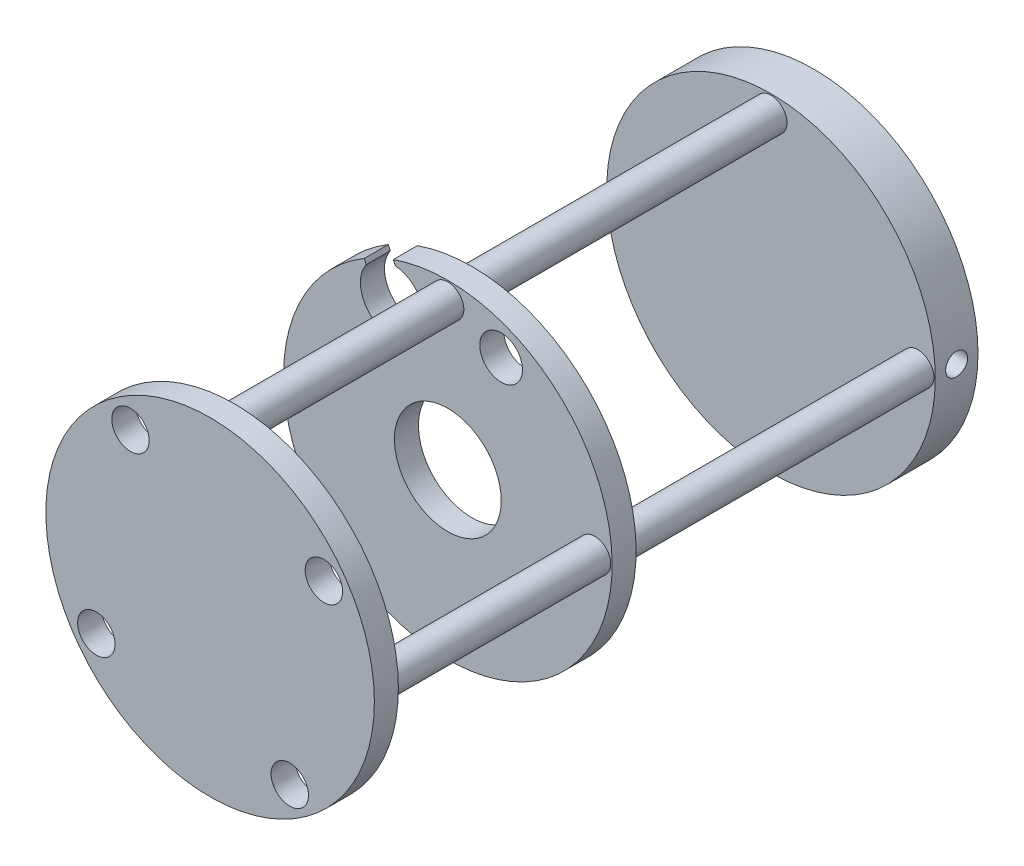
ISO-10303-21;
HEADER;
FILE_DESCRIPTION(('STEP AP214'),'2;1');
FILE_NAME('part.step','',(''),(''),'','','');
FILE_SCHEMA(('AUTOMOTIVE_DESIGN { 1 0 10303 214 1 1 1 1 }'));
ENDSEC;
DATA;
#1=APPLICATION_CONTEXT('core data for automotive mechanical design processes');
#2=APPLICATION_PROTOCOL_DEFINITION('international standard','automotive_design',2000,#1);
#3=PRODUCT_CONTEXT('',#1,'mechanical');
#4=PRODUCT('Part','Part','',(#3));
#5=PRODUCT_RELATED_PRODUCT_CATEGORY('part','',(#4));
#6=PRODUCT_DEFINITION_FORMATION('','',#4);
#7=PRODUCT_DEFINITION_CONTEXT('part definition',#1,'design');
#8=PRODUCT_DEFINITION('design','',#6,#7);
#9=PRODUCT_DEFINITION_SHAPE('','',#8);
#10=(LENGTH_UNIT() NAMED_UNIT(*) SI_UNIT(.MILLI.,.METRE.));
#11=(NAMED_UNIT(*) PLANE_ANGLE_UNIT() SI_UNIT($,.RADIAN.));
#12=(NAMED_UNIT(*) SI_UNIT($,.STERADIAN.) SOLID_ANGLE_UNIT());
#13=UNCERTAINTY_MEASURE_WITH_UNIT(LENGTH_MEASURE(1.E-05),#10,'distance_accuracy_value','');
#14=(GEOMETRIC_REPRESENTATION_CONTEXT(3) GLOBAL_UNCERTAINTY_ASSIGNED_CONTEXT((#13)) GLOBAL_UNIT_ASSIGNED_CONTEXT((#10,
#11,#12)) REPRESENTATION_CONTEXT('',''));
#15=CARTESIAN_POINT('',(0.,0.,0.));
#16=DIRECTION('',(0.,0.,1.));
#17=DIRECTION('',(1.,0.,0.));
#18=AXIS2_PLACEMENT_3D('',#15,#16,#17);
#19=CARTESIAN_POINT('',(0.,0.,8.));
#20=DIRECTION('',(0.,0.,-1.));
#21=DIRECTION('',(-1.,0.,0.));
#22=AXIS2_PLACEMENT_3D('',#19,#20,#21);
#23=CYLINDRICAL_SURFACE('',#22,30.75);
#24=CARTESIAN_POINT('',(30.7489837230436,0.249999999999997,6.05));
#25=CARTESIAN_POINT('',(30.7480473841755,0.365054128626898,6.04999493741304));
#26=CARTESIAN_POINT('',(30.7464595504185,0.480183356898924,6.04028147835291));
#27=CARTESIAN_POINT('',(30.7420759657299,0.70725092235472,6.00167772018999));
#28=CARTESIAN_POINT('',(30.7392788091532,0.819185384237812,5.97276508408072));
#29=CARTESIAN_POINT('',(30.7327170546429,1.03654210733708,5.89660217410777));
#30=CARTESIAN_POINT('',(30.7289529880111,1.14196790562595,5.84936196370515));
#31=CARTESIAN_POINT('',(30.7208080442409,1.34336287169728,5.73790185489006));
#32=CARTESIAN_POINT('',(30.7164273071522,1.43933417826457,5.67368580889602));
#33=CARTESIAN_POINT('',(30.7074665261803,1.61930382289991,5.52996392432266));
#34=CARTESIAN_POINT('',(30.7028861621272,1.70328192874572,5.45043276802647));
#35=CARTESIAN_POINT('',(30.6939906982729,1.85670568438727,5.27839038628644));
#36=CARTESIAN_POINT('',(30.6896756094502,1.92615073300704,5.18587862414982));
#37=CARTESIAN_POINT('',(30.6817472464589,2.04857651082416,4.99041882489982));
#38=CARTESIAN_POINT('',(30.6781344558778,2.10154591019618,4.88746367040535));
#39=CARTESIAN_POINT('',(30.6719874807874,2.18943747033299,4.67408844482033));
#40=CARTESIAN_POINT('',(30.6694532797991,2.22435990682588,4.56366848780892));
#41=CARTESIAN_POINT('',(30.6657313815876,2.27509811922697,4.33873693819937));
#42=CARTESIAN_POINT('',(30.6645409552107,2.29095262565975,4.22423412769942));
#43=CARTESIAN_POINT('',(30.6636216606051,2.30322523239106,3.99418671987999));
#44=CARTESIAN_POINT('',(30.663892770287,2.29964362644485,3.87864213833208));
#45=CARTESIAN_POINT('',(30.6658661897426,2.27317453323833,3.6500275243571));
#46=CARTESIAN_POINT('',(30.6675657177658,2.25032456954983,3.53695312022455));
#47=CARTESIAN_POINT('',(30.6722157746009,2.18602601260693,3.31624955925269));
#48=CARTESIAN_POINT('',(30.675166312463,2.14457728480312,3.20862044181259));
#49=CARTESIAN_POINT('',(30.6820174951758,2.04421671508385,3.00174304787194));
#50=CARTESIAN_POINT('',(30.6859190555858,1.98528803310192,2.9025029723313));
#51=CARTESIAN_POINT('',(30.694272171217,1.85165410524363,2.71530955281524));
#52=CARTESIAN_POINT('',(30.6987237351484,1.77694860949601,2.62735638763601));
#53=CARTESIAN_POINT('',(30.7077396761418,1.61366361834007,2.46500521880112));
#54=CARTESIAN_POINT('',(30.7123043047292,1.525050304628,2.39064123847332));
#55=CARTESIAN_POINT('',(30.7210827738481,1.33658420379989,2.25783933765293));
#56=CARTESIAN_POINT('',(30.7252966132673,1.23673138104904,2.19940146765601));
#57=CARTESIAN_POINT('',(30.7329694296527,1.02855778113563,2.10009124598507));
#58=CARTESIAN_POINT('',(30.7364280592544,0.920233138276761,2.05922696907439));
#59=CARTESIAN_POINT('',(30.742272115125,0.698230599520152,1.99627827655653));
#60=CARTESIAN_POINT('',(30.7446575557344,0.584552775177604,1.97419361000019));
#61=CARTESIAN_POINT('',(30.7481603466494,0.355312368791692,1.94946995787845));
#62=CARTESIAN_POINT('',(30.7492802181731,0.23975400090079,1.9467922526643));
#63=CARTESIAN_POINT('',(30.7502133745382,0.00982131862332939,1.96086276194988));
#64=CARTESIAN_POINT('',(30.75002667067,-0.10455300598602,1.97761080859022));
#65=CARTESIAN_POINT('',(30.7484471707666,-0.328708089432933,2.03001849822155));
#66=CARTESIAN_POINT('',(30.7470560271616,-0.438494925841157,2.06565220507788));
#67=CARTESIAN_POINT('',(30.7433010703666,-0.650534009322303,2.15479927119378));
#68=CARTESIAN_POINT('',(30.7409372499141,-0.752786200132166,2.20831276394962));
#69=CARTESIAN_POINT('',(30.7355688483695,-0.946977898422493,2.33176846144646));
#70=CARTESIAN_POINT('',(30.7325635651184,-1.03890593520102,2.40172867770182));
#71=CARTESIAN_POINT('',(30.7263141116997,-1.20972803116623,2.55606631294425));
#72=CARTESIAN_POINT('',(30.7230699389461,-1.2886219492309,2.64044388800974));
#73=CARTESIAN_POINT('',(30.7167560690092,-1.43126410991758,2.82138082271521));
#74=CARTESIAN_POINT('',(30.7136866586254,-1.49498797300933,2.91795941425343));
#75=CARTESIAN_POINT('',(30.7081181565923,-1.60531737590719,3.12045923526309));
#76=CARTESIAN_POINT('',(30.7056190624331,-1.65192299104779,3.22638042361682));
#77=CARTESIAN_POINT('',(30.7015067762808,-1.72667083191642,3.4445183918588));
#78=CARTESIAN_POINT('',(30.6998932309062,-1.75482042346256,3.55673264074614));
#79=CARTESIAN_POINT('',(30.6977527376575,-1.7918779765724,3.78430449295607));
#80=CARTESIAN_POINT('',(30.6972257802736,-1.80078610653878,3.89966206875909));
#81=CARTESIAN_POINT('',(30.6973242668487,-1.79910618531107,4.13005704822733));
#82=CARTESIAN_POINT('',(30.697947945305,-1.78854800268722,4.24509467161267));
#83=CARTESIAN_POINT('',(30.7002664173102,-1.74829707458787,4.47176083829171));
#84=CARTESIAN_POINT('',(30.7019612132084,-1.71860428714379,4.58338937410759));
#85=CARTESIAN_POINT('',(30.7062101199798,-1.64093340634149,4.80007323563779));
#86=CARTESIAN_POINT('',(30.7087642249203,-1.59295543922253,4.90512860672684));
#87=CARTESIAN_POINT('',(30.7144110137768,-1.48007948065531,5.10569745769102));
#88=CARTESIAN_POINT('',(30.7175036834804,-1.41518193568301,5.20121118926017));
#89=CARTESIAN_POINT('',(30.7238401748803,-1.27019789725713,5.38013639454667));
#90=CARTESIAN_POINT('',(30.7270842055362,-1.19008990734682,5.46353044179988));
#91=CARTESIAN_POINT('',(30.7332999763342,-1.01698422131257,5.61571454061052));
#92=CARTESIAN_POINT('',(30.7362716505374,-0.923983417394737,5.68450106089287));
#93=CARTESIAN_POINT('',(30.7415460842534,-0.727660177339493,5.80554619705098));
#94=CARTESIAN_POINT('',(30.7438482290039,-0.624328371496823,5.85778962693267));
#95=CARTESIAN_POINT('',(30.747446232742,-0.410420647607896,5.94412377293829));
#96=CARTESIAN_POINT('',(30.7487432685566,-0.299853366250004,5.97823570349058));
#97=CARTESIAN_POINT('',(30.7498673098793,-0.115509933032948,6.01849276640713));
#98=CARTESIAN_POINT('',(30.7500567064319,-0.0429216187633697,6.03029299784674));
#99=CARTESIAN_POINT('',(30.7499138500759,0.103100924956617,6.04604822404568));
#100=CARTESIAN_POINT('',(30.7495815980837,0.176535152921034,6.05000323258436));
#101=CARTESIAN_POINT('',(30.7489837230436,0.249999999999997,6.05));
#102=B_SPLINE_CURVE_WITH_KNOTS('',3,(#24,#25,#26,#27,#28,#29,#30,#31,#32,#33,#34,#35,#36,#37,
#38,#39,#40,#41,#42,#43,#44,#45,#46,#47,#48,#49,#50,#51,#52,#53,#54,#55,#56,#57,#58,#59,#60,#61,
#62,#63,#64,#65,#66,#67,#68,#69,#70,#71,#72,#73,#74,#75,#76,#77,#78,#79,#80,#81,#82,#83,#84,#85,
#86,#87,#88,#89,#90,#91,#92,#93,#94,#95,#96,#97,#98,#99,#100,#101),.UNSPECIFIED.,.T.,.F.,(4,2,2,
2,2,2,2,2,2,2,2,2,2,2,2,2,2,2,2,2,2,2,2,2,2,2,2,2,2,2,2,2,2,2,2,2,2,2,4),(0.,0.344905467446549,
0.690212914906254,1.03533102573964,1.38037088418192,1.72598610904037,2.07161562782965,
2.41748230318726,2.76334369411085,3.1085013830877,3.45365385540393,3.79813571928113,
4.14262007529075,4.48743738900244,4.83226016429835,5.17793478705619,5.5236105058048,
5.86944488732811,6.21527464744517,6.56041423756808,6.90555084533584,7.25021469217384,
7.59488111244116,7.93992676471648,8.28497615259879,8.63057637538304,8.97617507722166,
9.32163576616507,9.66709343159923,10.0120214774385,10.3569502798225,10.7018767008914,
11.0467940209192,11.3922024800337,11.7376943445918,12.0835024456457,12.4289050446318,
12.6491359240413,12.8693664166369),.UNSPECIFIED.);
#103=CARTESIAN_POINT('',(30.7489837230436,0.249999999999997,6.05));
#104=VERTEX_POINT('',#103);
#105=EDGE_CURVE('E156',#104,#104,#102,.T.);
#106=ORIENTED_EDGE('',*,*,#105,.T.);
#107=EDGE_LOOP('',(#106));
#108=FACE_BOUND('',#107,.T.);
#109=CARTESIAN_POINT('',(-30.75,0.,6.03469899493758));
#110=CARTESIAN_POINT('',(-30.7499991569928,-0.114182970529061,6.02066443587242));
#111=CARTESIAN_POINT('',(-30.7493573958681,-0.227261893721089,5.99698615917373));
#112=CARTESIAN_POINT('',(-30.7469361737667,-0.447924968709638,5.93098225836839));
#113=CARTESIAN_POINT('',(-30.745155388456,-0.555502566715208,5.88863494576224));
#114=CARTESIAN_POINT('',(-30.7407313762978,-0.761968021183546,5.78652500612322));
#115=CARTESIAN_POINT('',(-30.7380886104552,-0.860860486828509,5.72677169000028));
#116=CARTESIAN_POINT('',(-30.7323053804257,-1.04719155619179,5.59155399590492));
#117=CARTESIAN_POINT('',(-30.7291650304844,-1.13463278072514,5.51609322312978));
#118=CARTESIAN_POINT('',(-30.7227942177098,-1.29573851013687,5.35147092091243));
#119=CARTESIAN_POINT('',(-30.7195636375875,-1.36938402346344,5.262290808001));
#120=CARTESIAN_POINT('',(-30.7134307999628,-1.50066727510562,5.07282251795252));
#121=CARTESIAN_POINT('',(-30.7105285548578,-1.55830440909292,4.97253392166175));
#122=CARTESIAN_POINT('',(-30.7054189124962,-1.65594460042698,4.76365566948334));
#123=CARTESIAN_POINT('',(-30.703211732416,-1.69594214775998,4.6550634322288));
#124=CARTESIAN_POINT('',(-30.6997709361764,-1.75713176080577,4.43268960657363));
#125=CARTESIAN_POINT('',(-30.6985373084593,-1.77832404976984,4.3189080797958));
#126=CARTESIAN_POINT('',(-30.6971991157951,-1.80127773182749,4.08956386773195));
#127=CARTESIAN_POINT('',(-30.6970928989197,-1.80306755428817,3.9740040369815));
#128=CARTESIAN_POINT('',(-30.6980184724104,-1.78723880093902,3.74422669501866));
#129=CARTESIAN_POINT('',(-30.6990502558511,-1.76962034323859,3.63000917564189));
#130=CARTESIAN_POINT('',(-30.7021218698563,-1.71549968341927,3.40623858483636));
#131=CARTESIAN_POINT('',(-30.7041610005304,-1.67901059152043,3.29668233214614));
#132=CARTESIAN_POINT('',(-30.708991969214,-1.58819652332006,3.08524765889216));
#133=CARTESIAN_POINT('',(-30.7117838148895,-1.53387136536499,2.98336931653799));
#134=CARTESIAN_POINT('',(-30.7177726968115,-1.40884621285753,2.79004232960044));
#135=CARTESIAN_POINT('',(-30.720970238723,-1.33812569031545,2.69860697629437));
#136=CARTESIAN_POINT('',(-30.7273594016084,-1.18234736512807,2.52889549956932));
#137=CARTESIAN_POINT('',(-30.7305510225406,-1.09728946169038,2.45061946866865));
#138=CARTESIAN_POINT('',(-30.7365143772867,-0.915139694690968,2.30936513804578));
#139=CARTESIAN_POINT('',(-30.7392856598498,-0.818035098903794,2.24640323554169));
#140=CARTESIAN_POINT('',(-30.7440252096972,-0.614614377883046,2.13767834725366));
#141=CARTESIAN_POINT('',(-30.7459934831296,-0.508298323183734,2.09191522978897));
#142=CARTESIAN_POINT('',(-30.748830450333,-0.289592287427553,2.01893576584422));
#143=CARTESIAN_POINT('',(-30.7497003147114,-0.177208905970766,1.99169968885053));
#144=CARTESIAN_POINT('',(-30.7501692314872,0.0505368838593607,1.95647576204697));
#145=CARTESIAN_POINT('',(-30.749768298726,0.165899257425896,1.94848768744452));
#146=CARTESIAN_POINT('',(-30.747663564754,0.3961276356834,1.9519815224564));
#147=CARTESIAN_POINT('',(-30.7459618879557,0.510994142919063,1.96343172211372));
#148=CARTESIAN_POINT('',(-30.7413709980339,0.737162324927676,2.00540691921793));
#149=CARTESIAN_POINT('',(-30.738481780702,0.848463987066605,2.0359319842594));
#150=CARTESIAN_POINT('',(-30.731762200261,1.0644147167128,2.11520145889451));
#151=CARTESIAN_POINT('',(-30.7279313335929,1.16906018692357,2.16395562402285));
#152=CARTESIAN_POINT('',(-30.7196873056816,1.36868754823397,2.27829450170634));
#153=CARTESIAN_POINT('',(-30.7152741357097,1.4636692944367,2.34387946656888));
#154=CARTESIAN_POINT('',(-30.7062852512765,1.64149456204707,2.49018917866061));
#155=CARTESIAN_POINT('',(-30.701709203009,1.72431113285278,2.57094666375384));
#156=CARTESIAN_POINT('',(-30.6928620899002,1.87521880462202,2.74522879527891));
#157=CARTESIAN_POINT('',(-30.6885910265569,1.94330983326622,2.83875350440882));
#158=CARTESIAN_POINT('',(-30.6807868494609,2.062867787406,3.03598921789491));
#159=CARTESIAN_POINT('',(-30.6772541644697,2.11432506344159,3.13970608953343));
#160=CARTESIAN_POINT('',(-30.6712950230648,2.19908572184384,3.35433966724277));
#161=CARTESIAN_POINT('',(-30.6688685496125,2.23238938382622,3.46525626238854));
#162=CARTESIAN_POINT('',(-30.6653785445216,2.27983106413438,3.69089118164161));
#163=CARTESIAN_POINT('',(-30.6643121442902,2.29400942416699,3.80560097896125));
#164=CARTESIAN_POINT('',(-30.6636442090908,2.30292102355583,4.0357771230282));
#165=CARTESIAN_POINT('',(-30.6640426582197,2.29765447401483,4.15124346154859));
#166=CARTESIAN_POINT('',(-30.666260635535,2.26785731700607,4.37942962177913));
#167=CARTESIAN_POINT('',(-30.6680775263364,2.24336246129988,4.49215414081257));
#168=CARTESIAN_POINT('',(-30.6729405311939,2.17585734342039,4.71188743749501));
#169=CARTESIAN_POINT('',(-30.6759866560334,2.13284691881938,4.81889616499302));
#170=CARTESIAN_POINT('',(-30.6829982366629,2.02948090495911,5.02429534105205));
#171=CARTESIAN_POINT('',(-30.6869647105355,1.96910608950611,5.12267607810175));
#172=CARTESIAN_POINT('',(-30.6954100604739,1.83274444542021,5.30791706864392));
#173=CARTESIAN_POINT('',(-30.6998889257447,1.75675794566255,5.39477756475798));
#174=CARTESIAN_POINT('',(-30.7089193030603,1.59111778152941,5.55473153295747));
#175=CARTESIAN_POINT('',(-30.7134709610586,1.50143242715702,5.62779218158711));
#176=CARTESIAN_POINT('',(-30.7221869098359,1.31102947714312,5.75784216678903));
#177=CARTESIAN_POINT('',(-30.7263511072344,1.21030923469561,5.81482763583252));
#178=CARTESIAN_POINT('',(-30.7338941100782,1.000631250314,5.91111958250541));
#179=CARTESIAN_POINT('',(-30.7372722932039,0.891667071152619,5.95041207474674));
#180=CARTESIAN_POINT('',(-30.7429287371227,0.668743570724911,6.01008402077575));
#181=CARTESIAN_POINT('',(-30.7452082849948,0.554790265987842,6.03048563166126));
#182=CARTESIAN_POINT('',(-30.7478996557481,0.366821345216907,6.04799131259232));
#183=CARTESIAN_POINT('',(-30.7486889666146,0.293299423069049,6.05085922981602));
#184=CARTESIAN_POINT('',(-30.7497394074834,0.146368083060356,6.04869684251469));
#185=CARTESIAN_POINT('',(-30.7500005386502,0.0729586649518082,6.04366655540511));
#186=CARTESIAN_POINT('',(-30.75,0.,6.03469899493758));
#187=B_SPLINE_CURVE_WITH_KNOTS('',3,(#109,#110,#111,#112,#113,#114,#115,#116,#117,#118,#119,
#120,#121,#122,#123,#124,#125,#126,#127,#128,#129,#130,#131,#132,#133,#134,#135,#136,#137,#138,
#139,#140,#141,#142,#143,#144,#145,#146,#147,#148,#149,#150,#151,#152,#153,#154,#155,#156,#157,
#158,#159,#160,#161,#162,#163,#164,#165,#166,#167,#168,#169,#170,#171,#172,#173,#174,#175,#176,
#177,#178,#179,#180,#181,#182,#183,#184,#185,#186),.UNSPECIFIED.,.T.,.F.,(4,2,2,2,2,2,2,2,2,2,2,
2,2,2,2,2,2,2,2,2,2,2,2,2,2,2,2,2,2,2,2,2,2,2,2,2,2,2,4),(0.,0.344858325441614,
0.690118345476824,1.03519401531944,1.38019057007547,1.72565862129241,2.07113971241521,
2.41672864391039,2.76231347260602,3.10739186629636,3.45246816001839,3.79730503620584,
4.14214542453485,4.48741992826625,4.83269685939297,5.17834187553776,5.5239842452329,
5.86925794173334,6.2145276058494,6.5592345673123,6.90394275030181,7.24883567291501,
7.59373376605583,7.93938477785374,8.28503748715707,8.63089035581322,8.97673789723087,
9.32185478286438,9.66696792176333,10.0114408970547,10.3559168942944,10.7007757801934,
11.045627402051,11.3912892126495,11.737034115262,12.0830518337418,12.4286631923538,
12.6490153025118,12.8693669267966),.UNSPECIFIED.);
#188=CARTESIAN_POINT('',(-30.75,0.,6.03469899493758));
#189=VERTEX_POINT('',#188);
#190=EDGE_CURVE('E11',#189,#189,#187,.T.);
#191=ORIENTED_EDGE('',*,*,#190,.T.);
#192=EDGE_LOOP('',(#191));
#193=FACE_BOUND('',#192,.T.);
#194=CARTESIAN_POINT('',(0.,0.,8.));
#195=DIRECTION('',(0.,0.,1.));
#196=DIRECTION('',(1.,0.,0.));
#197=AXIS2_PLACEMENT_3D('',#194,#195,#196);
#198=CIRCLE('',#197,30.75);
#199=CARTESIAN_POINT('',(30.75,0.,8.));
#200=VERTEX_POINT('',#199);
#201=EDGE_CURVE('E134',#200,#200,#198,.T.);
#202=ORIENTED_EDGE('',*,*,#201,.F.);
#203=EDGE_LOOP('',(#202));
#204=FACE_BOUND('',#203,.T.);
#205=CARTESIAN_POINT('',(0.,0.,0.));
#206=DIRECTION('',(0.,0.,1.));
#207=DIRECTION('',(1.,0.,0.));
#208=AXIS2_PLACEMENT_3D('',#205,#206,#207);
#209=CIRCLE('',#208,30.75);
#210=CARTESIAN_POINT('',(30.75,0.,0.));
#211=VERTEX_POINT('',#210);
#212=EDGE_CURVE('E131',#211,#211,#209,.T.);
#213=ORIENTED_EDGE('',*,*,#212,.T.);
#214=EDGE_LOOP('',(#213));
#215=FACE_BOUND('',#214,.T.);
#216=ADVANCED_FACE('F36',(#108,#193,#204,#215),#23,.T.);
#217=CARTESIAN_POINT('',(0.,0.,8.));
#218=DIRECTION('',(0.,0.,1.));
#219=DIRECTION('',(1.,0.,0.));
#220=AXIS2_PLACEMENT_3D('',#217,#218,#219);
#221=PLANE('',#220);
#222=CARTESIAN_POINT('',(0.,-27.5,8.));
#223=DIRECTION('',(0.,0.,1.));
#224=DIRECTION('',(1.,0.,0.));
#225=AXIS2_PLACEMENT_3D('',#222,#223,#224);
#226=CIRCLE('',#225,3.);
#227=CARTESIAN_POINT('',(3.,-27.5,8.));
#228=VERTEX_POINT('',#227);
#229=EDGE_CURVE('E101',#228,#228,#226,.T.);
#230=ORIENTED_EDGE('',*,*,#229,.F.);
#231=EDGE_LOOP('',(#230));
#232=FACE_BOUND('',#231,.T.);
#233=CARTESIAN_POINT('',(-27.5,0.,8.));
#234=DIRECTION('',(0.,0.,1.));
#235=DIRECTION('',(1.,0.,0.));
#236=AXIS2_PLACEMENT_3D('',#233,#234,#235);
#237=CIRCLE('',#236,3.);
#238=CARTESIAN_POINT('',(-24.5,0.,8.));
#239=VERTEX_POINT('',#238);
#240=EDGE_CURVE('E114',#239,#239,#237,.T.);
#241=ORIENTED_EDGE('',*,*,#240,.F.);
#242=EDGE_LOOP('',(#241));
#243=FACE_BOUND('',#242,.T.);
#244=CARTESIAN_POINT('',(27.5,0.,8.));
#245=DIRECTION('',(0.,0.,1.));
#246=DIRECTION('',(1.,0.,0.));
#247=AXIS2_PLACEMENT_3D('',#244,#245,#246);
#248=CIRCLE('',#247,3.);
#249=CARTESIAN_POINT('',(30.5,0.,8.));
#250=VERTEX_POINT('',#249);
#251=EDGE_CURVE('E119',#250,#250,#248,.T.);
#252=ORIENTED_EDGE('',*,*,#251,.F.);
#253=EDGE_LOOP('',(#252));
#254=FACE_BOUND('',#253,.T.);
#255=CARTESIAN_POINT('',(0.,27.5,8.));
#256=DIRECTION('',(0.,0.,1.));
#257=DIRECTION('',(1.,0.,0.));
#258=AXIS2_PLACEMENT_3D('',#255,#256,#257);
#259=CIRCLE('',#258,3.);
#260=CARTESIAN_POINT('',(3.,27.5,8.));
#261=VERTEX_POINT('',#260);
#262=EDGE_CURVE('E125',#261,#261,#259,.T.);
#263=ORIENTED_EDGE('',*,*,#262,.F.);
#264=EDGE_LOOP('',(#263));
#265=FACE_BOUND('',#264,.T.);
#266=ORIENTED_EDGE('',*,*,#201,.T.);
#267=EDGE_LOOP('',(#266));
#268=FACE_BOUND('',#267,.T.);
#269=ADVANCED_FACE('F241',(#232,#243,#254,#265,#268),#221,.T.);
#270=CARTESIAN_POINT('',(0.,0.,0.));
#271=DIRECTION('',(0.,0.,1.));
#272=DIRECTION('',(1.,0.,0.));
#273=AXIS2_PLACEMENT_3D('',#270,#271,#272);
#274=PLANE('',#273);
#275=ORIENTED_EDGE('',*,*,#212,.F.);
#276=EDGE_LOOP('',(#275));
#277=FACE_BOUND('',#276,.T.);
#278=ADVANCED_FACE('F239',(#277),#274,.F.);
#279=CARTESIAN_POINT('',(0.,27.5,64.));
#280=DIRECTION('',(0.,0.,-1.));
#281=DIRECTION('',(-1.,0.,0.));
#282=AXIS2_PLACEMENT_3D('',#279,#280,#281);
#283=CYLINDRICAL_SURFACE('',#282,3.);
#284=CARTESIAN_POINT('',(0.,27.5,64.));
#285=DIRECTION('',(0.,0.,1.));
#286=DIRECTION('',(1.,0.,0.));
#287=AXIS2_PLACEMENT_3D('',#284,#285,#286);
#288=CIRCLE('',#287,3.);
#289=CARTESIAN_POINT('',(3.,27.5,64.));
#290=VERTEX_POINT('',#289);
#291=EDGE_CURVE('E128',#290,#290,#288,.T.);
#292=ORIENTED_EDGE('',*,*,#291,.F.);
#293=EDGE_LOOP('',(#292));
#294=FACE_BOUND('',#293,.T.);
#295=ORIENTED_EDGE('',*,*,#262,.T.);
#296=EDGE_LOOP('',(#295));
#297=FACE_BOUND('',#296,.T.);
#298=ADVANCED_FACE('F235',(#294,#297),#283,.T.);
#299=CARTESIAN_POINT('',(27.5,0.,64.));
#300=DIRECTION('',(0.,0.,-1.));
#301=DIRECTION('',(-1.,0.,0.));
#302=AXIS2_PLACEMENT_3D('',#299,#300,#301);
#303=CYLINDRICAL_SURFACE('',#302,3.);
#304=CARTESIAN_POINT('',(27.5,0.,64.));
#305=DIRECTION('',(0.,0.,1.));
#306=DIRECTION('',(1.,0.,0.));
#307=AXIS2_PLACEMENT_3D('',#304,#305,#306);
#308=CIRCLE('',#307,3.);
#309=CARTESIAN_POINT('',(30.5,0.,64.));
#310=VERTEX_POINT('',#309);
#311=EDGE_CURVE('E122',#310,#310,#308,.T.);
#312=ORIENTED_EDGE('',*,*,#311,.F.);
#313=EDGE_LOOP('',(#312));
#314=FACE_BOUND('',#313,.T.);
#315=ORIENTED_EDGE('',*,*,#251,.T.);
#316=EDGE_LOOP('',(#315));
#317=FACE_BOUND('',#316,.T.);
#318=ADVANCED_FACE('F231',(#314,#317),#303,.T.);
#319=CARTESIAN_POINT('',(-27.5,0.,64.));
#320=DIRECTION('',(0.,0.,-1.));
#321=DIRECTION('',(-1.,0.,0.));
#322=AXIS2_PLACEMENT_3D('',#319,#320,#321);
#323=CYLINDRICAL_SURFACE('',#322,3.);
#324=CARTESIAN_POINT('',(-27.5,0.,64.));
#325=DIRECTION('',(0.,0.,1.));
#326=DIRECTION('',(1.,0.,0.));
#327=AXIS2_PLACEMENT_3D('',#324,#325,#326);
#328=CIRCLE('',#327,3.);
#329=CARTESIAN_POINT('',(-24.5,0.,64.));
#330=VERTEX_POINT('',#329);
#331=EDGE_CURVE('E116',#330,#330,#328,.T.);
#332=ORIENTED_EDGE('',*,*,#331,.F.);
#333=EDGE_LOOP('',(#332));
#334=FACE_BOUND('',#333,.T.);
#335=ORIENTED_EDGE('',*,*,#240,.T.);
#336=EDGE_LOOP('',(#335));
#337=FACE_BOUND('',#336,.T.);
#338=ADVANCED_FACE('F227',(#334,#337),#323,.T.);
#339=CARTESIAN_POINT('',(0.,-27.5,64.));
#340=DIRECTION('',(0.,0.,-1.));
#341=DIRECTION('',(-1.,0.,0.));
#342=AXIS2_PLACEMENT_3D('',#339,#340,#341);
#343=CYLINDRICAL_SURFACE('',#342,3.);
#344=CARTESIAN_POINT('',(0.,-27.5,64.));
#345=DIRECTION('',(0.,0.,1.));
#346=DIRECTION('',(1.,0.,0.));
#347=AXIS2_PLACEMENT_3D('',#344,#345,#346);
#348=CIRCLE('',#347,3.);
#349=CARTESIAN_POINT('',(3.,-27.5,64.));
#350=VERTEX_POINT('',#349);
#351=EDGE_CURVE('E105',#350,#350,#348,.T.);
#352=ORIENTED_EDGE('',*,*,#351,.F.);
#353=EDGE_LOOP('',(#352));
#354=FACE_BOUND('',#353,.T.);
#355=ORIENTED_EDGE('',*,*,#229,.T.);
#356=EDGE_LOOP('',(#355));
#357=FACE_BOUND('',#356,.T.);
#358=ADVANCED_FACE('F224',(#354,#357),#343,.T.);
#359=CARTESIAN_POINT('',(0.,0.,68.5));
#360=DIRECTION('',(0.,0.,-1.));
#361=DIRECTION('',(-1.,0.,0.));
#362=AXIS2_PLACEMENT_3D('',#359,#360,#361);
#363=CYLINDRICAL_SURFACE('',#362,30.75);
#364=CARTESIAN_POINT('',(0.,0.,64.));
#365=DIRECTION('',(0.,0.,1.));
#366=DIRECTION('',(1.,0.,0.));
#367=AXIS2_PLACEMENT_3D('',#364,#365,#366);
#368=CIRCLE('',#367,30.75);
#369=CARTESIAN_POINT('',(-15.652440464028,26.4681621485146,64.));
#370=VERTEX_POINT('',#369);
#371=CARTESIAN_POINT('',(-10.214593741808,29.0038717189588,64.));
#372=VERTEX_POINT('',#371);
#373=EDGE_CURVE('E102',#370,#372,#368,.T.);
#374=ORIENTED_EDGE('',*,*,#373,.T.);
#375=DIRECTION('',(0.,0.,1.));
#376=VECTOR('',#375,1.);
#377=CARTESIAN_POINT('',(-10.214593741808,29.0038717189588,58.5));
#378=LINE('',#377,#376);
#379=CARTESIAN_POINT('',(-10.214593741808,29.0038717189588,68.5));
#380=VERTEX_POINT('',#379);
#381=EDGE_CURVE('E61',#372,#380,#378,.T.);
#382=ORIENTED_EDGE('',*,*,#381,.T.);
#383=CARTESIAN_POINT('',(0.,0.,68.5));
#384=DIRECTION('',(0.,0.,1.));
#385=DIRECTION('',(1.,0.,0.));
#386=AXIS2_PLACEMENT_3D('',#383,#384,#385);
#387=CIRCLE('',#386,30.75);
#388=CARTESIAN_POINT('',(-15.652440464028,26.4681621485146,68.5));
#389=VERTEX_POINT('',#388);
#390=EDGE_CURVE('E95',#389,#380,#387,.T.);
#391=ORIENTED_EDGE('',*,*,#390,.F.);
#392=DIRECTION('',(0.,0.,1.));
#393=VECTOR('',#392,1.);
#394=CARTESIAN_POINT('',(-15.652440464028,26.4681621485146,58.5));
#395=LINE('',#394,#393);
#396=EDGE_CURVE('E77',#370,#389,#395,.T.);
#397=ORIENTED_EDGE('',*,*,#396,.F.);
#398=EDGE_LOOP('',(#374,#382,#391,#397));
#399=FACE_BOUND('',#398,.T.);
#400=ADVANCED_FACE('F100',(#399),#363,.T.);
#401=CARTESIAN_POINT('',(0.,0.,68.5));
#402=DIRECTION('',(0.,0.,1.));
#403=DIRECTION('',(1.,0.,0.));
#404=AXIS2_PLACEMENT_3D('',#401,#402,#403);
#405=PLANE('',#404);
#406=CARTESIAN_POINT('',(0.,0.,68.5));
#407=DIRECTION('',(0.,0.,1.));
#408=DIRECTION('',(1.,0.,0.));
#409=AXIS2_PLACEMENT_3D('',#406,#407,#408);
#410=CIRCLE('',#409,10.);
#411=CARTESIAN_POINT('',(10.,0.,68.5));
#412=VERTEX_POINT('',#411);
#413=EDGE_CURVE('E150',#412,#412,#410,.T.);
#414=ORIENTED_EDGE('',*,*,#413,.F.);
#415=EDGE_LOOP('',(#414));
#416=FACE_BOUND('',#415,.T.);
#417=DIRECTION('',(-0.422618261740692,0.906307787036653,0.));
#418=VECTOR('',#417,1.);
#419=CARTESIAN_POINT('',(-10.214593741808,29.0038717189588,68.5));
#420=LINE('',#419,#418);
#421=CARTESIAN_POINT('',(-9.83121295616107,28.1817089709485,68.5));
#422=VERTEX_POINT('',#421);
#423=EDGE_CURVE('E88',#422,#380,#420,.T.);
#424=ORIENTED_EDGE('',*,*,#423,.F.);
#425=CARTESIAN_POINT('',(-10.354147412647,22.204540782398,68.5));
#426=DIRECTION('',(0.,0.,1.));
#427=DIRECTION('',(1.,0.,0.));
#428=AXIS2_PLACEMENT_3D('',#425,#426,#427);
#429=CIRCLE('',#428,6.);
#430=CARTESIAN_POINT('',(-15.269059678381,25.6459994005043,68.5));
#431=VERTEX_POINT('',#430);
#432=EDGE_CURVE('E97',#431,#422,#429,.T.);
#433=ORIENTED_EDGE('',*,*,#432,.F.);
#434=DIRECTION('',(0.422618261740696,-0.906307787036652,0.));
#435=VECTOR('',#434,1.);
#436=CARTESIAN_POINT('',(-15.652440464028,26.4681621485146,68.5));
#437=LINE('',#436,#435);
#438=EDGE_CURVE('E80',#389,#431,#437,.T.);
#439=ORIENTED_EDGE('',*,*,#438,.F.);
#440=ORIENTED_EDGE('',*,*,#390,.T.);
#441=EDGE_LOOP('',(#424,#433,#439,#440));
#442=FACE_BOUND('',#441,.T.);
#443=CARTESIAN_POINT('',(9.98690326969372,23.2244207572088,68.5));
#444=DIRECTION('',(0.,0.,1.));
#445=DIRECTION('',(1.,0.,0.));
#446=AXIS2_PLACEMENT_3D('',#443,#444,#445);
#447=CIRCLE('',#446,4.);
#448=CARTESIAN_POINT('',(13.9869032696937,23.2244207572088,68.5));
#449=VERTEX_POINT('',#448);
#450=EDGE_CURVE('E143',#449,#449,#447,.T.);
#451=ORIENTED_EDGE('',*,*,#450,.F.);
#452=EDGE_LOOP('',(#451));
#453=FACE_BOUND('',#452,.T.);
#454=CARTESIAN_POINT('',(27.5,0.,68.5));
#455=DIRECTION('',(0.,0.,1.));
#456=DIRECTION('',(1.,0.,0.));
#457=AXIS2_PLACEMENT_3D('',#454,#455,#456);
#458=CIRCLE('',#457,3.);
#459=CARTESIAN_POINT('',(30.5,0.,68.5));
#460=VERTEX_POINT('',#459);
#461=EDGE_CURVE('E142',#460,#460,#458,.T.);
#462=ORIENTED_EDGE('',*,*,#461,.F.);
#463=EDGE_LOOP('',(#462));
#464=FACE_BOUND('',#463,.T.);
#465=CARTESIAN_POINT('',(0.,27.5,68.5));
#466=DIRECTION('',(0.,0.,1.));
#467=DIRECTION('',(1.,0.,0.));
#468=AXIS2_PLACEMENT_3D('',#465,#466,#467);
#469=CIRCLE('',#468,3.);
#470=CARTESIAN_POINT('',(3.,27.5,68.5));
#471=VERTEX_POINT('',#470);
#472=EDGE_CURVE('E305',#471,#471,#469,.T.);
#473=ORIENTED_EDGE('',*,*,#472,.F.);
#474=EDGE_LOOP('',(#473));
#475=FACE_BOUND('',#474,.T.);
#476=CARTESIAN_POINT('',(-27.5,0.,68.5));
#477=DIRECTION('',(0.,0.,1.));
#478=DIRECTION('',(1.,0.,0.));
#479=AXIS2_PLACEMENT_3D('',#476,#477,#478);
#480=CIRCLE('',#479,3.);
#481=CARTESIAN_POINT('',(-24.5,0.,68.5));
#482=VERTEX_POINT('',#481);
#483=EDGE_CURVE('E311',#482,#482,#480,.T.);
#484=ORIENTED_EDGE('',*,*,#483,.F.);
#485=EDGE_LOOP('',(#484));
#486=FACE_BOUND('',#485,.T.);
#487=CARTESIAN_POINT('',(0.,-27.5,68.5));
#488=DIRECTION('',(0.,0.,1.));
#489=DIRECTION('',(1.,0.,0.));
#490=AXIS2_PLACEMENT_3D('',#487,#488,#489);
#491=CIRCLE('',#490,3.);
#492=CARTESIAN_POINT('',(3.,-27.5,68.5));
#493=VERTEX_POINT('',#492);
#494=EDGE_CURVE('E110',#493,#493,#491,.T.);
#495=ORIENTED_EDGE('',*,*,#494,.F.);
#496=EDGE_LOOP('',(#495));
#497=FACE_BOUND('',#496,.T.);
#498=ADVANCED_FACE('F93',(#416,#442,#453,#464,#475,#486,#497),#405,.T.);
#499=CARTESIAN_POINT('',(0.,0.,64.));
#500=DIRECTION('',(0.,0.,1.));
#501=DIRECTION('',(1.,0.,0.));
#502=AXIS2_PLACEMENT_3D('',#499,#500,#501);
#503=PLANE('',#502);
#504=CARTESIAN_POINT('',(0.,0.,64.));
#505=DIRECTION('',(0.,0.,1.));
#506=DIRECTION('',(1.,0.,0.));
#507=AXIS2_PLACEMENT_3D('',#504,#505,#506);
#508=CIRCLE('',#507,10.);
#509=CARTESIAN_POINT('',(10.,0.,64.));
#510=VERTEX_POINT('',#509);
#511=EDGE_CURVE('E98',#510,#510,#508,.T.);
#512=ORIENTED_EDGE('',*,*,#511,.T.);
#513=EDGE_LOOP('',(#512));
#514=FACE_BOUND('',#513,.T.);
#515=CARTESIAN_POINT('',(9.98690326969372,23.2244207572088,64.));
#516=DIRECTION('',(0.,0.,1.));
#517=DIRECTION('',(1.,0.,0.));
#518=AXIS2_PLACEMENT_3D('',#515,#516,#517);
#519=CIRCLE('',#518,4.);
#520=CARTESIAN_POINT('',(13.9869032696937,23.2244207572088,64.));
#521=VERTEX_POINT('',#520);
#522=EDGE_CURVE('E139',#521,#521,#519,.T.);
#523=ORIENTED_EDGE('',*,*,#522,.T.);
#524=EDGE_LOOP('',(#523));
#525=FACE_BOUND('',#524,.T.);
#526=ORIENTED_EDGE('',*,*,#291,.T.);
#527=EDGE_LOOP('',(#526));
#528=FACE_BOUND('',#527,.T.);
#529=ORIENTED_EDGE('',*,*,#311,.T.);
#530=EDGE_LOOP('',(#529));
#531=FACE_BOUND('',#530,.T.);
#532=ORIENTED_EDGE('',*,*,#331,.T.);
#533=EDGE_LOOP('',(#532));
#534=FACE_BOUND('',#533,.T.);
#535=ORIENTED_EDGE('',*,*,#351,.T.);
#536=EDGE_LOOP('',(#535));
#537=FACE_BOUND('',#536,.T.);
#538=CARTESIAN_POINT('',(-10.354147412647,22.204540782398,64.));
#539=DIRECTION('',(0.,0.,1.));
#540=DIRECTION('',(1.,0.,0.));
#541=AXIS2_PLACEMENT_3D('',#538,#539,#540);
#542=CIRCLE('',#541,6.);
#543=CARTESIAN_POINT('',(-15.269059678381,25.6459994005043,64.));
#544=VERTEX_POINT('',#543);
#545=CARTESIAN_POINT('',(-9.83121295616107,28.1817089709485,64.));
#546=VERTEX_POINT('',#545);
#547=EDGE_CURVE('E145',#544,#546,#542,.T.);
#548=ORIENTED_EDGE('',*,*,#547,.T.);
#549=DIRECTION('',(-0.422618261740693,0.906307787036653,0.));
#550=VECTOR('',#549,1.);
#551=CARTESIAN_POINT('',(2.71892336110986,1.26785478522203,64.));
#552=LINE('',#551,#550);
#553=EDGE_CURVE('E45',#546,#372,#552,.T.);
#554=ORIENTED_EDGE('',*,*,#553,.T.);
#555=ORIENTED_EDGE('',*,*,#373,.F.);
#556=DIRECTION('',(0.422618261740695,-0.906307787036652,0.));
#557=VECTOR('',#556,1.);
#558=CARTESIAN_POINT('',(-2.71892336110996,-1.26785478522209,64.));
#559=LINE('',#558,#557);
#560=EDGE_CURVE('E83',#370,#544,#559,.T.);
#561=ORIENTED_EDGE('',*,*,#560,.T.);
#562=EDGE_LOOP('',(#548,#554,#555,#561));
#563=FACE_BOUND('',#562,.T.);
#564=ADVANCED_FACE('F214',(#514,#525,#528,#531,#534,#537,#563),#503,.F.);
#565=CARTESIAN_POINT('',(0.,-27.5,108.5));
#566=DIRECTION('',(0.,0.,-1.));
#567=DIRECTION('',(-1.,0.,0.));
#568=AXIS2_PLACEMENT_3D('',#565,#566,#567);
#569=CYLINDRICAL_SURFACE('',#568,3.);
#570=CARTESIAN_POINT('',(0.,-27.5,108.5));
#571=DIRECTION('',(0.,0.,1.));
#572=DIRECTION('',(1.,0.,0.));
#573=AXIS2_PLACEMENT_3D('',#570,#571,#572);
#574=CIRCLE('',#573,3.);
#575=CARTESIAN_POINT('',(3.,-27.5,108.5));
#576=VERTEX_POINT('',#575);
#577=EDGE_CURVE('E107',#576,#576,#574,.T.);
#578=ORIENTED_EDGE('',*,*,#577,.F.);
#579=EDGE_LOOP('',(#578));
#580=FACE_BOUND('',#579,.T.);
#581=ORIENTED_EDGE('',*,*,#494,.T.);
#582=EDGE_LOOP('',(#581));
#583=FACE_BOUND('',#582,.T.);
#584=ADVANCED_FACE('F210',(#580,#583),#569,.T.);
#585=CARTESIAN_POINT('',(-27.5,0.,108.5));
#586=DIRECTION('',(0.,0.,-1.));
#587=DIRECTION('',(-1.,0.,0.));
#588=AXIS2_PLACEMENT_3D('',#585,#586,#587);
#589=CYLINDRICAL_SURFACE('',#588,3.);
#590=CARTESIAN_POINT('',(-27.5,0.,108.5));
#591=DIRECTION('',(0.,0.,1.));
#592=DIRECTION('',(1.,0.,0.));
#593=AXIS2_PLACEMENT_3D('',#590,#591,#592);
#594=CIRCLE('',#593,3.);
#595=CARTESIAN_POINT('',(-24.5,0.,108.5));
#596=VERTEX_POINT('',#595);
#597=EDGE_CURVE('E314',#596,#596,#594,.T.);
#598=ORIENTED_EDGE('',*,*,#597,.F.);
#599=EDGE_LOOP('',(#598));
#600=FACE_BOUND('',#599,.T.);
#601=ORIENTED_EDGE('',*,*,#483,.T.);
#602=EDGE_LOOP('',(#601));
#603=FACE_BOUND('',#602,.T.);
#604=ADVANCED_FACE('F206',(#600,#603),#589,.T.);
#605=CARTESIAN_POINT('',(0.,27.5,108.5));
#606=DIRECTION('',(0.,0.,-1.));
#607=DIRECTION('',(-1.,0.,0.));
#608=AXIS2_PLACEMENT_3D('',#605,#606,#607);
#609=CYLINDRICAL_SURFACE('',#608,3.);
#610=CARTESIAN_POINT('',(0.,27.5,108.5));
#611=DIRECTION('',(0.,0.,1.));
#612=DIRECTION('',(1.,0.,0.));
#613=AXIS2_PLACEMENT_3D('',#610,#611,#612);
#614=CIRCLE('',#613,3.);
#615=CARTESIAN_POINT('',(3.,27.5,108.5));
#616=VERTEX_POINT('',#615);
#617=EDGE_CURVE('E308',#616,#616,#614,.T.);
#618=ORIENTED_EDGE('',*,*,#617,.F.);
#619=EDGE_LOOP('',(#618));
#620=FACE_BOUND('',#619,.T.);
#621=ORIENTED_EDGE('',*,*,#472,.T.);
#622=EDGE_LOOP('',(#621));
#623=FACE_BOUND('',#622,.T.);
#624=ADVANCED_FACE('F202',(#620,#623),#609,.T.);
#625=CARTESIAN_POINT('',(27.5,0.,108.5));
#626=DIRECTION('',(0.,0.,-1.));
#627=DIRECTION('',(-1.,0.,0.));
#628=AXIS2_PLACEMENT_3D('',#625,#626,#627);
#629=CYLINDRICAL_SURFACE('',#628,3.);
#630=CARTESIAN_POINT('',(27.5,0.,108.5));
#631=DIRECTION('',(0.,0.,1.));
#632=DIRECTION('',(1.,0.,0.));
#633=AXIS2_PLACEMENT_3D('',#630,#631,#632);
#634=CIRCLE('',#633,3.);
#635=CARTESIAN_POINT('',(30.5,0.,108.5));
#636=VERTEX_POINT('',#635);
#637=EDGE_CURVE('E302',#636,#636,#634,.T.);
#638=ORIENTED_EDGE('',*,*,#637,.F.);
#639=EDGE_LOOP('',(#638));
#640=FACE_BOUND('',#639,.T.);
#641=ORIENTED_EDGE('',*,*,#461,.T.);
#642=EDGE_LOOP('',(#641));
#643=FACE_BOUND('',#642,.T.);
#644=ADVANCED_FACE('F198',(#640,#643),#629,.T.);
#645=CARTESIAN_POINT('',(9.98690326969372,23.2244207572088,62.5));
#646=DIRECTION('',(0.,0.,1.));
#647=DIRECTION('',(1.,0.,0.));
#648=AXIS2_PLACEMENT_3D('',#645,#646,#647);
#649=CYLINDRICAL_SURFACE('',#648,4.);
#650=ORIENTED_EDGE('',*,*,#450,.T.);
#651=EDGE_LOOP('',(#650));
#652=FACE_BOUND('',#651,.T.);
#653=ORIENTED_EDGE('',*,*,#522,.F.);
#654=EDGE_LOOP('',(#653));
#655=FACE_BOUND('',#654,.T.);
#656=ADVANCED_FACE('F190',(#652,#655),#649,.F.);
#657=CARTESIAN_POINT('',(-10.214593741808,29.0038717189588,58.5));
#658=DIRECTION('',(0.906307787036653,0.422618261740693,0.));
#659=DIRECTION('',(-0.422618261740693,0.906307787036653,0.));
#660=AXIS2_PLACEMENT_3D('',#657,#658,#659);
#661=PLANE('',#660);
#662=DIRECTION('',(0.,0.,1.));
#663=VECTOR('',#662,1.);
#664=CARTESIAN_POINT('',(-9.83121295616107,28.1817089709485,58.5));
#665=LINE('',#664,#663);
#666=EDGE_CURVE('E297',#546,#422,#665,.T.);
#667=ORIENTED_EDGE('',*,*,#666,.T.);
#668=ORIENTED_EDGE('',*,*,#423,.T.);
#669=ORIENTED_EDGE('',*,*,#381,.F.);
#670=ORIENTED_EDGE('',*,*,#553,.F.);
#671=EDGE_LOOP('',(#667,#668,#669,#670));
#672=FACE_BOUND('',#671,.T.);
#673=ADVANCED_FACE('F186',(#672),#661,.F.);
#674=CARTESIAN_POINT('',(-10.354147412647,22.204540782398,58.5));
#675=DIRECTION('',(0.,0.,1.));
#676=DIRECTION('',(1.,0.,0.));
#677=AXIS2_PLACEMENT_3D('',#674,#675,#676);
#678=CYLINDRICAL_SURFACE('',#677,6.);
#679=DIRECTION('',(0.,0.,1.));
#680=VECTOR('',#679,1.);
#681=CARTESIAN_POINT('',(-15.269059678381,25.6459994005043,58.5));
#682=LINE('',#681,#680);
#683=EDGE_CURVE('E53',#544,#431,#682,.T.);
#684=ORIENTED_EDGE('',*,*,#683,.T.);
#685=ORIENTED_EDGE('',*,*,#432,.T.);
#686=ORIENTED_EDGE('',*,*,#666,.F.);
#687=ORIENTED_EDGE('',*,*,#547,.F.);
#688=EDGE_LOOP('',(#684,#685,#686,#687));
#689=FACE_BOUND('',#688,.T.);
#690=ADVANCED_FACE('F189',(#689),#678,.F.);
#691=CARTESIAN_POINT('',(-15.652440464028,26.4681621485146,58.5));
#692=DIRECTION('',(-0.906307787036652,-0.422618261740695,0.));
#693=DIRECTION('',(0.422618261740695,-0.906307787036652,0.));
#694=AXIS2_PLACEMENT_3D('',#691,#692,#693);
#695=PLANE('',#694);
#696=ORIENTED_EDGE('',*,*,#396,.T.);
#697=ORIENTED_EDGE('',*,*,#438,.T.);
#698=ORIENTED_EDGE('',*,*,#683,.F.);
#699=ORIENTED_EDGE('',*,*,#560,.F.);
#700=EDGE_LOOP('',(#696,#697,#698,#699));
#701=FACE_BOUND('',#700,.T.);
#702=ADVANCED_FACE('F79',(#701),#695,.F.);
#703=CARTESIAN_POINT('',(0.,0.,58.5));
#704=DIRECTION('',(0.,0.,1.));
#705=DIRECTION('',(1.,0.,0.));
#706=AXIS2_PLACEMENT_3D('',#703,#704,#705);
#707=CYLINDRICAL_SURFACE('',#706,10.);
#708=ORIENTED_EDGE('',*,*,#413,.T.);
#709=EDGE_LOOP('',(#708));
#710=FACE_BOUND('',#709,.T.);
#711=ORIENTED_EDGE('',*,*,#511,.F.);
#712=EDGE_LOOP('',(#711));
#713=FACE_BOUND('',#712,.T.);
#714=ADVANCED_FACE('F181',(#710,#713),#707,.F.);
#715=CARTESIAN_POINT('',(0.,0.,113.));
#716=DIRECTION('',(0.,0.,-1.));
#717=DIRECTION('',(-1.,0.,0.));
#718=AXIS2_PLACEMENT_3D('',#715,#716,#717);
#719=CYLINDRICAL_SURFACE('',#718,30.75);
#720=CARTESIAN_POINT('',(0.,0.,113.));
#721=DIRECTION('',(0.,0.,1.));
#722=DIRECTION('',(1.,0.,0.));
#723=AXIS2_PLACEMENT_3D('',#720,#721,#722);
#724=CIRCLE('',#723,30.75);
#725=CARTESIAN_POINT('',(30.75,0.,113.));
#726=VERTEX_POINT('',#725);
#727=EDGE_CURVE('E264',#726,#726,#724,.T.);
#728=ORIENTED_EDGE('',*,*,#727,.F.);
#729=EDGE_LOOP('',(#728));
#730=FACE_BOUND('',#729,.T.);
#731=CARTESIAN_POINT('',(0.,0.,108.5));
#732=DIRECTION('',(0.,0.,1.));
#733=DIRECTION('',(1.,0.,0.));
#734=AXIS2_PLACEMENT_3D('',#731,#732,#733);
#735=CIRCLE('',#734,30.75);
#736=CARTESIAN_POINT('',(30.75,0.,108.5));
#737=VERTEX_POINT('',#736);
#738=EDGE_CURVE('E262',#737,#737,#735,.T.);
#739=ORIENTED_EDGE('',*,*,#738,.T.);
#740=EDGE_LOOP('',(#739));
#741=FACE_BOUND('',#740,.T.);
#742=ADVANCED_FACE('F174',(#730,#741),#719,.T.);
#743=CARTESIAN_POINT('',(0.,0.,113.));
#744=DIRECTION('',(0.,0.,1.));
#745=DIRECTION('',(1.,0.,0.));
#746=AXIS2_PLACEMENT_3D('',#743,#744,#745);
#747=PLANE('',#746);
#748=CARTESIAN_POINT('',(21.2979531515138,14.9129873451271,113.));
#749=DIRECTION('',(0.,0.,1.));
#750=DIRECTION('',(1.,0.,0.));
#751=AXIS2_PLACEMENT_3D('',#748,#749,#750);
#752=CIRCLE('',#751,3.5);
#753=CARTESIAN_POINT('',(24.7979531515138,14.9129873451271,113.));
#754=VERTEX_POINT('',#753);
#755=EDGE_CURVE('E281',#754,#754,#752,.T.);
#756=ORIENTED_EDGE('',*,*,#755,.F.);
#757=EDGE_LOOP('',(#756));
#758=FACE_BOUND('',#757,.T.);
#759=CARTESIAN_POINT('',(-21.2979531515137,-14.9129873451273,113.));
#760=DIRECTION('',(0.,0.,1.));
#761=DIRECTION('',(-1.,0.,0.));
#762=AXIS2_PLACEMENT_3D('',#759,#760,#761);
#763=CIRCLE('',#762,3.5);
#764=CARTESIAN_POINT('',(-24.7979531515137,-14.9129873451273,113.));
#765=VERTEX_POINT('',#764);
#766=EDGE_CURVE('E286',#765,#765,#763,.T.);
#767=ORIENTED_EDGE('',*,*,#766,.F.);
#768=EDGE_LOOP('',(#767));
#769=FACE_BOUND('',#768,.T.);
#770=CARTESIAN_POINT('',(14.9129873451271,-21.2979531515139,113.));
#771=DIRECTION('',(0.,0.,1.));
#772=DIRECTION('',(-1.,0.,0.));
#773=AXIS2_PLACEMENT_3D('',#770,#771,#772);
#774=CIRCLE('',#773,3.5);
#775=CARTESIAN_POINT('',(11.4129873451271,-21.2979531515139,113.));
#776=VERTEX_POINT('',#775);
#777=EDGE_CURVE('E374',#776,#776,#774,.T.);
#778=ORIENTED_EDGE('',*,*,#777,.F.);
#779=EDGE_LOOP('',(#778));
#780=FACE_BOUND('',#779,.T.);
#781=CARTESIAN_POINT('',(-14.9129873451272,21.2979531515138,113.));
#782=DIRECTION('',(0.,0.,1.));
#783=DIRECTION('',(1.,0.,0.));
#784=AXIS2_PLACEMENT_3D('',#781,#782,#783);
#785=CIRCLE('',#784,3.5);
#786=CARTESIAN_POINT('',(-11.4129873451272,21.2979531515138,113.));
#787=VERTEX_POINT('',#786);
#788=EDGE_CURVE('E277',#787,#787,#785,.T.);
#789=ORIENTED_EDGE('',*,*,#788,.F.);
#790=EDGE_LOOP('',(#789));
#791=FACE_BOUND('',#790,.T.);
#792=ORIENTED_EDGE('',*,*,#727,.T.);
#793=EDGE_LOOP('',(#792));
#794=FACE_BOUND('',#793,.T.);
#795=ADVANCED_FACE('F170',(#758,#769,#780,#791,#794),#747,.T.);
#796=CARTESIAN_POINT('',(0.,0.,108.5));
#797=DIRECTION('',(0.,0.,1.));
#798=DIRECTION('',(1.,0.,0.));
#799=AXIS2_PLACEMENT_3D('',#796,#797,#798);
#800=PLANE('',#799);
#801=CARTESIAN_POINT('',(21.2979531515138,14.9129873451271,108.5));
#802=DIRECTION('',(0.,0.,1.));
#803=DIRECTION('',(1.,0.,0.));
#804=AXIS2_PLACEMENT_3D('',#801,#802,#803);
#805=CIRCLE('',#804,3.5);
#806=CARTESIAN_POINT('',(24.7979531515138,14.9129873451271,108.5));
#807=VERTEX_POINT('',#806);
#808=EDGE_CURVE('E40',#807,#807,#805,.T.);
#809=ORIENTED_EDGE('',*,*,#808,.T.);
#810=EDGE_LOOP('',(#809));
#811=FACE_BOUND('',#810,.T.);
#812=CARTESIAN_POINT('',(-21.2979531515137,-14.9129873451273,108.5));
#813=DIRECTION('',(0.,0.,1.));
#814=DIRECTION('',(1.,0.,0.));
#815=AXIS2_PLACEMENT_3D('',#812,#813,#814);
#816=CIRCLE('',#815,3.5);
#817=CARTESIAN_POINT('',(-17.7979531515137,-14.9129873451273,108.5));
#818=VERTEX_POINT('',#817);
#819=EDGE_CURVE('E267',#818,#818,#816,.T.);
#820=ORIENTED_EDGE('',*,*,#819,.T.);
#821=EDGE_LOOP('',(#820));
#822=FACE_BOUND('',#821,.T.);
#823=CARTESIAN_POINT('',(14.9129873451271,-21.2979531515139,108.5));
#824=DIRECTION('',(0.,0.,1.));
#825=DIRECTION('',(1.,0.,0.));
#826=AXIS2_PLACEMENT_3D('',#823,#824,#825);
#827=CIRCLE('',#826,3.5);
#828=CARTESIAN_POINT('',(18.4129873451271,-21.2979531515139,108.5));
#829=VERTEX_POINT('',#828);
#830=EDGE_CURVE('E270',#829,#829,#827,.T.);
#831=ORIENTED_EDGE('',*,*,#830,.T.);
#832=EDGE_LOOP('',(#831));
#833=FACE_BOUND('',#832,.T.);
#834=CARTESIAN_POINT('',(-14.9129873451272,21.2979531515138,108.5));
#835=DIRECTION('',(0.,0.,1.));
#836=DIRECTION('',(1.,0.,0.));
#837=AXIS2_PLACEMENT_3D('',#834,#835,#836);
#838=CIRCLE('',#837,3.5);
#839=CARTESIAN_POINT('',(-11.4129873451272,21.2979531515138,108.5));
#840=VERTEX_POINT('',#839);
#841=EDGE_CURVE('E274',#840,#840,#838,.T.);
#842=ORIENTED_EDGE('',*,*,#841,.T.);
#843=EDGE_LOOP('',(#842));
#844=FACE_BOUND('',#843,.T.);
#845=ORIENTED_EDGE('',*,*,#577,.T.);
#846=EDGE_LOOP('',(#845));
#847=FACE_BOUND('',#846,.T.);
#848=ORIENTED_EDGE('',*,*,#597,.T.);
#849=EDGE_LOOP('',(#848));
#850=FACE_BOUND('',#849,.T.);
#851=ORIENTED_EDGE('',*,*,#617,.T.);
#852=EDGE_LOOP('',(#851));
#853=FACE_BOUND('',#852,.T.);
#854=ORIENTED_EDGE('',*,*,#637,.T.);
#855=EDGE_LOOP('',(#854));
#856=FACE_BOUND('',#855,.T.);
#857=ORIENTED_EDGE('',*,*,#738,.F.);
#858=EDGE_LOOP('',(#857));
#859=FACE_BOUND('',#858,.T.);
#860=ADVANCED_FACE('F167',(#811,#822,#833,#844,#847,#850,#853,#856,#859),#800,.F.);
#861=CARTESIAN_POINT('',(31.25,0.249999999999997,4.));
#862=DIRECTION('',(-1.,0.,0.));
#863=DIRECTION('',(0.,0.,1.));
#864=AXIS2_PLACEMENT_3D('',#861,#862,#863);
#865=CYLINDRICAL_SURFACE('',#864,2.05);
#866=ORIENTED_EDGE('',*,*,#105,.F.);
#867=EDGE_LOOP('',(#866));
#868=FACE_BOUND('',#867,.T.);
#869=ORIENTED_EDGE('',*,*,#190,.F.);
#870=EDGE_LOOP('',(#869));
#871=FACE_BOUND('',#870,.T.);
#872=ADVANCED_FACE('F161',(#868,#871),#865,.F.);
#873=CARTESIAN_POINT('',(-14.9129873451272,21.2979531515138,103.));
#874=DIRECTION('',(0.,0.,1.));
#875=DIRECTION('',(1.,0.,0.));
#876=AXIS2_PLACEMENT_3D('',#873,#874,#875);
#877=CYLINDRICAL_SURFACE('',#876,3.5);
#878=ORIENTED_EDGE('',*,*,#788,.T.);
#879=EDGE_LOOP('',(#878));
#880=FACE_BOUND('',#879,.T.);
#881=ORIENTED_EDGE('',*,*,#841,.F.);
#882=EDGE_LOOP('',(#881));
#883=FACE_BOUND('',#882,.T.);
#884=ADVANCED_FACE('F166',(#880,#883),#877,.F.);
#885=CARTESIAN_POINT('',(14.9129873451271,-21.2979531515139,103.));
#886=DIRECTION('',(0.,0.,1.));
#887=DIRECTION('',(1.,0.,0.));
#888=AXIS2_PLACEMENT_3D('',#885,#886,#887);
#889=CYLINDRICAL_SURFACE('',#888,3.5);
#890=ORIENTED_EDGE('',*,*,#777,.T.);
#891=EDGE_LOOP('',(#890));
#892=FACE_BOUND('',#891,.T.);
#893=ORIENTED_EDGE('',*,*,#830,.F.);
#894=EDGE_LOOP('',(#893));
#895=FACE_BOUND('',#894,.T.);
#896=ADVANCED_FACE('F379',(#892,#895),#889,.F.);
#897=CARTESIAN_POINT('',(-21.2979531515137,-14.9129873451273,103.));
#898=DIRECTION('',(0.,0.,1.));
#899=DIRECTION('',(1.,0.,0.));
#900=AXIS2_PLACEMENT_3D('',#897,#898,#899);
#901=CYLINDRICAL_SURFACE('',#900,3.5);
#902=ORIENTED_EDGE('',*,*,#766,.T.);
#903=EDGE_LOOP('',(#902));
#904=FACE_BOUND('',#903,.T.);
#905=ORIENTED_EDGE('',*,*,#819,.F.);
#906=EDGE_LOOP('',(#905));
#907=FACE_BOUND('',#906,.T.);
#908=ADVANCED_FACE('F384',(#904,#907),#901,.F.);
#909=CARTESIAN_POINT('',(21.2979531515138,14.9129873451271,103.));
#910=DIRECTION('',(0.,0.,1.));
#911=DIRECTION('',(1.,0.,0.));
#912=AXIS2_PLACEMENT_3D('',#909,#910,#911);
#913=CYLINDRICAL_SURFACE('',#912,3.5);
#914=ORIENTED_EDGE('',*,*,#755,.T.);
#915=EDGE_LOOP('',(#914));
#916=FACE_BOUND('',#915,.T.);
#917=ORIENTED_EDGE('',*,*,#808,.F.);
#918=EDGE_LOOP('',(#917));
#919=FACE_BOUND('',#918,.T.);
#920=ADVANCED_FACE('F392',(#916,#919),#913,.F.);
#921=CLOSED_SHELL('',(#216,#269,#278,#298,#318,#338,#358,#400,#498,#564,#584,#604,#624,#644,
#656,#673,#690,#702,#714,#742,#795,#860,#872,#884,#896,#908,#920));
#922=MANIFOLD_SOLID_BREP('B2',#921);
#923=ADVANCED_BREP_SHAPE_REPRESENTATION('',(#18,#922),#14);
#924=SHAPE_DEFINITION_REPRESENTATION(#9,#923);
ENDSEC;
END-ISO-10303-21;
